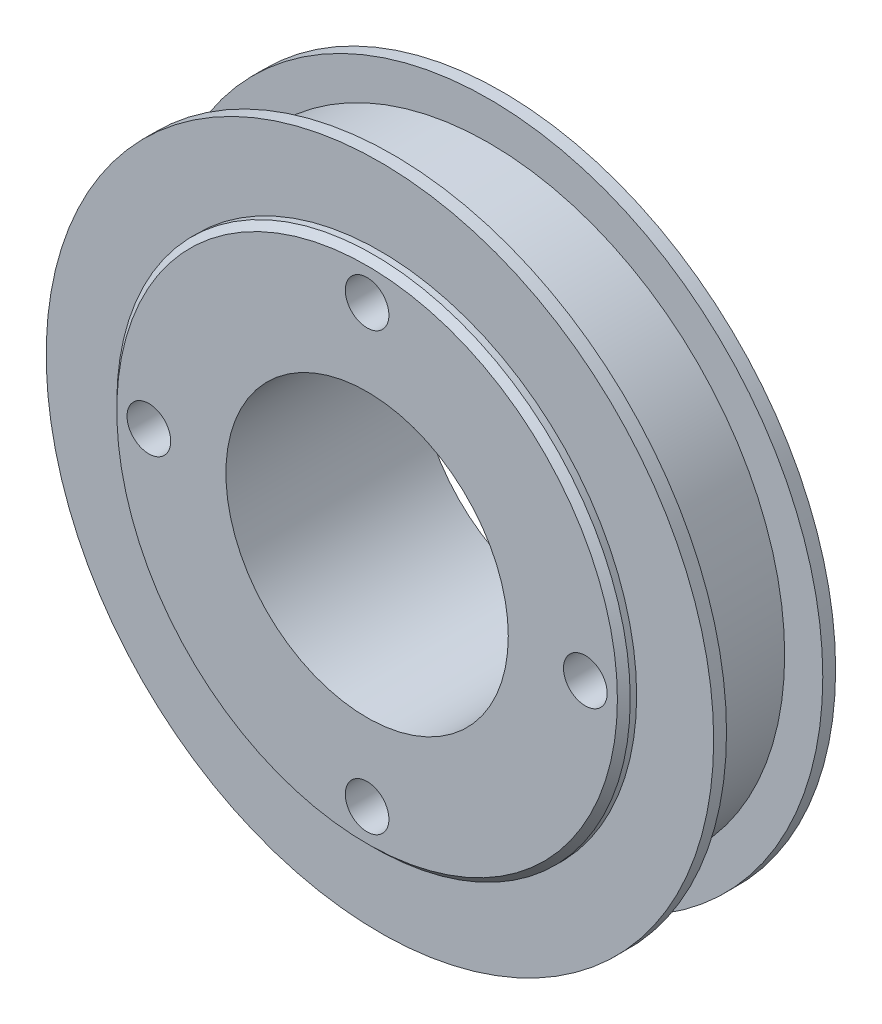
ISO-10303-21;
HEADER;
FILE_DESCRIPTION(('STEP AP214'),'2;1');
FILE_NAME('part.step','',(''),(''),'','','');
FILE_SCHEMA(('AUTOMOTIVE_DESIGN { 1 0 10303 214 1 1 1 1 }'));
ENDSEC;
DATA;
#1=APPLICATION_CONTEXT('core data for automotive mechanical design processes');
#2=APPLICATION_PROTOCOL_DEFINITION('international standard','automotive_design',2000,#1);
#3=PRODUCT_CONTEXT('',#1,'mechanical');
#4=PRODUCT('Part','Part','',(#3));
#5=PRODUCT_RELATED_PRODUCT_CATEGORY('part','',(#4));
#6=PRODUCT_DEFINITION_FORMATION('','',#4);
#7=PRODUCT_DEFINITION_CONTEXT('part definition',#1,'design');
#8=PRODUCT_DEFINITION('design','',#6,#7);
#9=PRODUCT_DEFINITION_SHAPE('','',#8);
#10=(LENGTH_UNIT() NAMED_UNIT(*) SI_UNIT(.MILLI.,.METRE.));
#11=(NAMED_UNIT(*) PLANE_ANGLE_UNIT() SI_UNIT($,.RADIAN.));
#12=(NAMED_UNIT(*) SI_UNIT($,.STERADIAN.) SOLID_ANGLE_UNIT());
#13=UNCERTAINTY_MEASURE_WITH_UNIT(LENGTH_MEASURE(1.E-05),#10,'distance_accuracy_value','');
#14=(GEOMETRIC_REPRESENTATION_CONTEXT(3) GLOBAL_UNCERTAINTY_ASSIGNED_CONTEXT((#13)) GLOBAL_UNIT_ASSIGNED_CONTEXT((#10,
#11,#12)) REPRESENTATION_CONTEXT('',''));
#15=CARTESIAN_POINT('',(0.,0.,0.));
#16=DIRECTION('',(0.,0.,1.));
#17=DIRECTION('',(1.,0.,0.));
#18=AXIS2_PLACEMENT_3D('',#15,#16,#17);
#19=CARTESIAN_POINT('',(0.,0.,15.));
#20=DIRECTION('',(0.,0.,1.));
#21=DIRECTION('',(1.,0.,0.));
#22=AXIS2_PLACEMENT_3D('',#19,#20,#21);
#23=PLANE('',#22);
#24=CARTESIAN_POINT('',(0.,0.,15.));
#25=DIRECTION('',(0.,0.,1.));
#26=DIRECTION('',(1.,0.,0.));
#27=AXIS2_PLACEMENT_3D('',#24,#25,#26);
#28=CIRCLE('',#27,19.5);
#29=CARTESIAN_POINT('',(19.5,0.,15.));
#30=VERTEX_POINT('',#29);
#31=EDGE_CURVE('E65',#30,#30,#28,.T.);
#32=ORIENTED_EDGE('',*,*,#31,.T.);
#33=EDGE_LOOP('',(#32));
#34=FACE_BOUND('',#33,.T.);
#35=CARTESIAN_POINT('',(0.,17.,15.));
#36=DIRECTION('',(0.,0.,-1.));
#37=DIRECTION('',(-1.,0.,0.));
#38=AXIS2_PLACEMENT_3D('',#35,#36,#37);
#39=CIRCLE('',#38,1.69999999999999);
#40=CARTESIAN_POINT('',(-1.69999999999999,17.,15.));
#41=VERTEX_POINT('',#40);
#42=EDGE_CURVE('E151',#41,#41,#39,.T.);
#43=ORIENTED_EDGE('',*,*,#42,.T.);
#44=EDGE_LOOP('',(#43));
#45=FACE_BOUND('',#44,.T.);
#46=CARTESIAN_POINT('',(-17.,0.,15.));
#47=DIRECTION('',(0.,0.,-1.));
#48=DIRECTION('',(-1.,0.,0.));
#49=AXIS2_PLACEMENT_3D('',#46,#47,#48);
#50=CIRCLE('',#49,1.69999999999999);
#51=CARTESIAN_POINT('',(-18.7,0.,15.));
#52=VERTEX_POINT('',#51);
#53=EDGE_CURVE('E143',#52,#52,#50,.T.);
#54=ORIENTED_EDGE('',*,*,#53,.T.);
#55=EDGE_LOOP('',(#54));
#56=FACE_BOUND('',#55,.T.);
#57=CARTESIAN_POINT('',(0.,-17.,15.));
#58=DIRECTION('',(0.,0.,-1.));
#59=DIRECTION('',(-1.,0.,0.));
#60=AXIS2_PLACEMENT_3D('',#57,#58,#59);
#61=CIRCLE('',#60,1.69999999999999);
#62=CARTESIAN_POINT('',(-1.69999999999999,-17.,15.));
#63=VERTEX_POINT('',#62);
#64=EDGE_CURVE('E135',#63,#63,#61,.T.);
#65=ORIENTED_EDGE('',*,*,#64,.T.);
#66=EDGE_LOOP('',(#65));
#67=FACE_BOUND('',#66,.T.);
#68=CARTESIAN_POINT('',(0.,0.,15.));
#69=DIRECTION('',(0.,0.,1.));
#70=DIRECTION('',(1.,0.,0.));
#71=AXIS2_PLACEMENT_3D('',#68,#69,#70);
#72=CIRCLE('',#71,11.);
#73=CARTESIAN_POINT('',(11.,0.,15.));
#74=VERTEX_POINT('',#73);
#75=EDGE_CURVE('E120',#74,#74,#72,.T.);
#76=ORIENTED_EDGE('',*,*,#75,.F.);
#77=EDGE_LOOP('',(#76));
#78=FACE_BOUND('',#77,.T.);
#79=CARTESIAN_POINT('',(17.,0.,15.));
#80=DIRECTION('',(0.,0.,-1.));
#81=DIRECTION('',(-1.,0.,0.));
#82=AXIS2_PLACEMENT_3D('',#79,#80,#81);
#83=CIRCLE('',#82,1.69999999999999);
#84=CARTESIAN_POINT('',(15.3,0.,15.));
#85=VERTEX_POINT('',#84);
#86=EDGE_CURVE('E124',#85,#85,#83,.T.);
#87=ORIENTED_EDGE('',*,*,#86,.T.);
#88=EDGE_LOOP('',(#87));
#89=FACE_BOUND('',#88,.T.);
#90=ADVANCED_FACE('F56',(#34,#45,#56,#67,#78,#89),#23,.T.);
#91=CARTESIAN_POINT('',(0.,0.,3.5));
#92=DIRECTION('',(0.,0.,-1.));
#93=DIRECTION('',(-1.,0.,0.));
#94=AXIS2_PLACEMENT_3D('',#91,#92,#93);
#95=CYLINDRICAL_SURFACE('',#94,13.);
#96=CARTESIAN_POINT('',(0.,0.,3.5));
#97=DIRECTION('',(0.,0.,1.));
#98=DIRECTION('',(1.,0.,0.));
#99=AXIS2_PLACEMENT_3D('',#96,#97,#98);
#100=CIRCLE('',#99,13.);
#101=CARTESIAN_POINT('',(13.,0.,3.5));
#102=VERTEX_POINT('',#101);
#103=EDGE_CURVE('E84',#102,#102,#100,.T.);
#104=ORIENTED_EDGE('',*,*,#103,.F.);
#105=EDGE_LOOP('',(#104));
#106=FACE_BOUND('',#105,.T.);
#107=CARTESIAN_POINT('',(0.,0.,0.));
#108=DIRECTION('',(0.,0.,1.));
#109=DIRECTION('',(1.,0.,0.));
#110=AXIS2_PLACEMENT_3D('',#107,#108,#109);
#111=CIRCLE('',#110,13.);
#112=CARTESIAN_POINT('',(13.,0.,0.));
#113=VERTEX_POINT('',#112);
#114=EDGE_CURVE('E80',#113,#113,#111,.T.);
#115=ORIENTED_EDGE('',*,*,#114,.T.);
#116=EDGE_LOOP('',(#115));
#117=FACE_BOUND('',#116,.T.);
#118=ADVANCED_FACE('F186',(#106,#117),#95,.T.);
#119=CARTESIAN_POINT('',(0.,0.,0.));
#120=DIRECTION('',(0.,0.,1.));
#121=DIRECTION('',(1.,0.,0.));
#122=AXIS2_PLACEMENT_3D('',#119,#120,#121);
#123=PLANE('',#122);
#124=CARTESIAN_POINT('',(0.,0.,0.));
#125=DIRECTION('',(0.,0.,1.));
#126=DIRECTION('',(1.,0.,0.));
#127=AXIS2_PLACEMENT_3D('',#124,#125,#126);
#128=CIRCLE('',#127,11.);
#129=CARTESIAN_POINT('',(11.,0.,0.));
#130=VERTEX_POINT('',#129);
#131=EDGE_CURVE('E116',#130,#130,#128,.T.);
#132=ORIENTED_EDGE('',*,*,#131,.T.);
#133=EDGE_LOOP('',(#132));
#134=FACE_BOUND('',#133,.T.);
#135=ORIENTED_EDGE('',*,*,#114,.F.);
#136=EDGE_LOOP('',(#135));
#137=FACE_BOUND('',#136,.T.);
#138=ADVANCED_FACE('F180',(#134,#137),#123,.F.);
#139=CARTESIAN_POINT('',(0.,0.,4.5));
#140=DIRECTION('',(0.,0.,-1.));
#141=DIRECTION('',(-1.,0.,0.));
#142=AXIS2_PLACEMENT_3D('',#139,#140,#141);
#143=CYLINDRICAL_SURFACE('',#142,20.);
#144=CARTESIAN_POINT('',(0.,0.,4.5));
#145=DIRECTION('',(0.,0.,1.));
#146=DIRECTION('',(1.,0.,0.));
#147=AXIS2_PLACEMENT_3D('',#144,#145,#146);
#148=CIRCLE('',#147,20.);
#149=CARTESIAN_POINT('',(20.,0.,4.5));
#150=VERTEX_POINT('',#149);
#151=EDGE_CURVE('E85',#150,#150,#148,.T.);
#152=ORIENTED_EDGE('',*,*,#151,.F.);
#153=EDGE_LOOP('',(#152));
#154=FACE_BOUND('',#153,.T.);
#155=CARTESIAN_POINT('',(0.,0.,3.5));
#156=DIRECTION('',(0.,0.,1.));
#157=DIRECTION('',(1.,0.,0.));
#158=AXIS2_PLACEMENT_3D('',#155,#156,#157);
#159=CIRCLE('',#158,20.);
#160=CARTESIAN_POINT('',(20.,0.,3.5));
#161=VERTEX_POINT('',#160);
#162=EDGE_CURVE('E89',#161,#161,#159,.T.);
#163=ORIENTED_EDGE('',*,*,#162,.T.);
#164=EDGE_LOOP('',(#163));
#165=FACE_BOUND('',#164,.T.);
#166=ADVANCED_FACE('F167',(#154,#165),#143,.T.);
#167=CARTESIAN_POINT('',(0.,0.,3.5));
#168=DIRECTION('',(0.,0.,1.));
#169=DIRECTION('',(1.,0.,0.));
#170=AXIS2_PLACEMENT_3D('',#167,#168,#169);
#171=PLANE('',#170);
#172=CARTESIAN_POINT('',(0.,17.,3.5));
#173=DIRECTION('',(0.,0.,-1.));
#174=DIRECTION('',(-1.,0.,0.));
#175=AXIS2_PLACEMENT_3D('',#172,#173,#174);
#176=CIRCLE('',#175,1.69999999999999);
#177=CARTESIAN_POINT('',(-1.69999999999999,17.,3.5));
#178=VERTEX_POINT('',#177);
#179=EDGE_CURVE('E155',#178,#178,#176,.T.);
#180=ORIENTED_EDGE('',*,*,#179,.F.);
#181=EDGE_LOOP('',(#180));
#182=FACE_BOUND('',#181,.T.);
#183=CARTESIAN_POINT('',(-17.,0.,3.5));
#184=DIRECTION('',(0.,0.,-1.));
#185=DIRECTION('',(-1.,0.,0.));
#186=AXIS2_PLACEMENT_3D('',#183,#184,#185);
#187=CIRCLE('',#186,1.69999999999999);
#188=CARTESIAN_POINT('',(-18.7,0.,3.5));
#189=VERTEX_POINT('',#188);
#190=EDGE_CURVE('E147',#189,#189,#187,.T.);
#191=ORIENTED_EDGE('',*,*,#190,.F.);
#192=EDGE_LOOP('',(#191));
#193=FACE_BOUND('',#192,.T.);
#194=CARTESIAN_POINT('',(0.,-17.,3.5));
#195=DIRECTION('',(0.,0.,-1.));
#196=DIRECTION('',(-1.,0.,0.));
#197=AXIS2_PLACEMENT_3D('',#194,#195,#196);
#198=CIRCLE('',#197,1.69999999999999);
#199=CARTESIAN_POINT('',(-1.69999999999999,-17.,3.5));
#200=VERTEX_POINT('',#199);
#201=EDGE_CURVE('E139',#200,#200,#198,.T.);
#202=ORIENTED_EDGE('',*,*,#201,.F.);
#203=EDGE_LOOP('',(#202));
#204=FACE_BOUND('',#203,.T.);
#205=CARTESIAN_POINT('',(17.,0.,3.5));
#206=DIRECTION('',(0.,0.,-1.));
#207=DIRECTION('',(-1.,0.,0.));
#208=AXIS2_PLACEMENT_3D('',#205,#206,#207);
#209=CIRCLE('',#208,1.69999999999999);
#210=CARTESIAN_POINT('',(15.3,0.,3.5));
#211=VERTEX_POINT('',#210);
#212=EDGE_CURVE('E131',#211,#211,#209,.T.);
#213=ORIENTED_EDGE('',*,*,#212,.F.);
#214=EDGE_LOOP('',(#213));
#215=FACE_BOUND('',#214,.T.);
#216=ORIENTED_EDGE('',*,*,#103,.T.);
#217=EDGE_LOOP('',(#216));
#218=FACE_BOUND('',#217,.T.);
#219=ORIENTED_EDGE('',*,*,#162,.F.);
#220=EDGE_LOOP('',(#219));
#221=FACE_BOUND('',#220,.T.);
#222=ADVANCED_FACE('F163',(#182,#193,#204,#215,#218,#221),#171,.F.);
#223=CARTESIAN_POINT('',(0.,0.,5.5));
#224=DIRECTION('',(0.,0.,-1.));
#225=DIRECTION('',(-1.,0.,0.));
#226=AXIS2_PLACEMENT_3D('',#223,#224,#225);
#227=CYLINDRICAL_SURFACE('',#226,26.);
#228=CARTESIAN_POINT('',(0.,0.,5.5));
#229=DIRECTION('',(0.,0.,1.));
#230=DIRECTION('',(1.,0.,0.));
#231=AXIS2_PLACEMENT_3D('',#228,#229,#230);
#232=CIRCLE('',#231,26.);
#233=CARTESIAN_POINT('',(26.,0.,5.5));
#234=VERTEX_POINT('',#233);
#235=EDGE_CURVE('E93',#234,#234,#232,.T.);
#236=ORIENTED_EDGE('',*,*,#235,.F.);
#237=EDGE_LOOP('',(#236));
#238=FACE_BOUND('',#237,.T.);
#239=CARTESIAN_POINT('',(0.,0.,4.5));
#240=DIRECTION('',(0.,0.,1.));
#241=DIRECTION('',(1.,0.,0.));
#242=AXIS2_PLACEMENT_3D('',#239,#240,#241);
#243=CIRCLE('',#242,26.);
#244=CARTESIAN_POINT('',(26.,0.,4.5));
#245=VERTEX_POINT('',#244);
#246=EDGE_CURVE('E97',#245,#245,#243,.T.);
#247=ORIENTED_EDGE('',*,*,#246,.T.);
#248=EDGE_LOOP('',(#247));
#249=FACE_BOUND('',#248,.T.);
#250=ADVANCED_FACE('F166',(#238,#249),#227,.T.);
#251=CARTESIAN_POINT('',(0.,0.,5.5));
#252=DIRECTION('',(0.,0.,1.));
#253=DIRECTION('',(1.,0.,0.));
#254=AXIS2_PLACEMENT_3D('',#251,#252,#253);
#255=PLANE('',#254);
#256=CARTESIAN_POINT('',(0.,0.,5.5));
#257=DIRECTION('',(0.,0.,1.));
#258=DIRECTION('',(1.,0.,0.));
#259=AXIS2_PLACEMENT_3D('',#256,#257,#258);
#260=CIRCLE('',#259,23.03);
#261=CARTESIAN_POINT('',(23.03,0.,5.5));
#262=VERTEX_POINT('',#261);
#263=EDGE_CURVE('E77',#262,#262,#260,.T.);
#264=ORIENTED_EDGE('',*,*,#263,.F.);
#265=EDGE_LOOP('',(#264));
#266=FACE_BOUND('',#265,.T.);
#267=ORIENTED_EDGE('',*,*,#235,.T.);
#268=EDGE_LOOP('',(#267));
#269=FACE_BOUND('',#268,.T.);
#270=ADVANCED_FACE('F221',(#266,#269),#255,.T.);
#271=CARTESIAN_POINT('',(0.,0.,4.5));
#272=DIRECTION('',(0.,0.,1.));
#273=DIRECTION('',(1.,0.,0.));
#274=AXIS2_PLACEMENT_3D('',#271,#272,#273);
#275=PLANE('',#274);
#276=ORIENTED_EDGE('',*,*,#151,.T.);
#277=EDGE_LOOP('',(#276));
#278=FACE_BOUND('',#277,.T.);
#279=ORIENTED_EDGE('',*,*,#246,.F.);
#280=EDGE_LOOP('',(#279));
#281=FACE_BOUND('',#280,.T.);
#282=ADVANCED_FACE('F219',(#278,#281),#275,.F.);
#283=CARTESIAN_POINT('',(0.,0.,13.));
#284=DIRECTION('',(0.,0.,-1.));
#285=DIRECTION('',(-1.,0.,0.));
#286=AXIS2_PLACEMENT_3D('',#283,#284,#285);
#287=CYLINDRICAL_SURFACE('',#286,23.03);
#288=CARTESIAN_POINT('',(0.,0.,13.));
#289=DIRECTION('',(0.,0.,1.));
#290=DIRECTION('',(1.,0.,0.));
#291=AXIS2_PLACEMENT_3D('',#288,#289,#290);
#292=CIRCLE('',#291,23.03);
#293=CARTESIAN_POINT('',(23.03,0.,13.));
#294=VERTEX_POINT('',#293);
#295=EDGE_CURVE('E101',#294,#294,#292,.T.);
#296=ORIENTED_EDGE('',*,*,#295,.F.);
#297=EDGE_LOOP('',(#296));
#298=FACE_BOUND('',#297,.T.);
#299=ORIENTED_EDGE('',*,*,#263,.T.);
#300=EDGE_LOOP('',(#299));
#301=FACE_BOUND('',#300,.T.);
#302=ADVANCED_FACE('F215',(#298,#301),#287,.T.);
#303=CARTESIAN_POINT('',(0.,0.,14.));
#304=DIRECTION('',(0.,0.,-1.));
#305=DIRECTION('',(-1.,0.,0.));
#306=AXIS2_PLACEMENT_3D('',#303,#304,#305);
#307=CYLINDRICAL_SURFACE('',#306,26.);
#308=CARTESIAN_POINT('',(0.,0.,14.));
#309=DIRECTION('',(0.,0.,1.));
#310=DIRECTION('',(1.,0.,0.));
#311=AXIS2_PLACEMENT_3D('',#308,#309,#310);
#312=CIRCLE('',#311,26.);
#313=CARTESIAN_POINT('',(26.,0.,14.));
#314=VERTEX_POINT('',#313);
#315=EDGE_CURVE('E111',#314,#314,#312,.T.);
#316=ORIENTED_EDGE('',*,*,#315,.F.);
#317=EDGE_LOOP('',(#316));
#318=FACE_BOUND('',#317,.T.);
#319=CARTESIAN_POINT('',(0.,0.,13.));
#320=DIRECTION('',(0.,0.,1.));
#321=DIRECTION('',(1.,0.,0.));
#322=AXIS2_PLACEMENT_3D('',#319,#320,#321);
#323=CIRCLE('',#322,26.);
#324=CARTESIAN_POINT('',(26.,0.,13.));
#325=VERTEX_POINT('',#324);
#326=EDGE_CURVE('E112',#325,#325,#323,.T.);
#327=ORIENTED_EDGE('',*,*,#326,.T.);
#328=EDGE_LOOP('',(#327));
#329=FACE_BOUND('',#328,.T.);
#330=ADVANCED_FACE('F208',(#318,#329),#307,.T.);
#331=CARTESIAN_POINT('',(0.,0.,14.));
#332=DIRECTION('',(0.,0.,1.));
#333=DIRECTION('',(1.,0.,0.));
#334=AXIS2_PLACEMENT_3D('',#331,#332,#333);
#335=PLANE('',#334);
#336=CARTESIAN_POINT('',(0.,0.,14.));
#337=DIRECTION('',(0.,0.,1.));
#338=DIRECTION('',(1.,0.,0.));
#339=AXIS2_PLACEMENT_3D('',#336,#337,#338);
#340=CIRCLE('',#339,20.);
#341=CARTESIAN_POINT('',(20.,0.,14.));
#342=VERTEX_POINT('',#341);
#343=EDGE_CURVE('E71',#342,#342,#340,.T.);
#344=ORIENTED_EDGE('',*,*,#343,.F.);
#345=EDGE_LOOP('',(#344));
#346=FACE_BOUND('',#345,.T.);
#347=ORIENTED_EDGE('',*,*,#315,.T.);
#348=EDGE_LOOP('',(#347));
#349=FACE_BOUND('',#348,.T.);
#350=ADVANCED_FACE('F205',(#346,#349),#335,.T.);
#351=CARTESIAN_POINT('',(0.,0.,13.));
#352=DIRECTION('',(0.,0.,1.));
#353=DIRECTION('',(1.,0.,0.));
#354=AXIS2_PLACEMENT_3D('',#351,#352,#353);
#355=PLANE('',#354);
#356=ORIENTED_EDGE('',*,*,#295,.T.);
#357=EDGE_LOOP('',(#356));
#358=FACE_BOUND('',#357,.T.);
#359=ORIENTED_EDGE('',*,*,#326,.F.);
#360=EDGE_LOOP('',(#359));
#361=FACE_BOUND('',#360,.T.);
#362=ADVANCED_FACE('F204',(#358,#361),#355,.F.);
#363=CARTESIAN_POINT('',(0.,0.,15.));
#364=DIRECTION('',(0.,0.,-1.));
#365=DIRECTION('',(-1.,0.,0.));
#366=AXIS2_PLACEMENT_3D('',#363,#364,#365);
#367=CYLINDRICAL_SURFACE('',#366,20.);
#368=CARTESIAN_POINT('',(0.,0.,14.5));
#369=DIRECTION('',(0.,0.,1.));
#370=DIRECTION('',(1.,0.,0.));
#371=AXIS2_PLACEMENT_3D('',#368,#369,#370);
#372=CIRCLE('',#371,20.);
#373=CARTESIAN_POINT('',(20.,0.,14.5));
#374=VERTEX_POINT('',#373);
#375=EDGE_CURVE('E12',#374,#374,#372,.F.);
#376=ORIENTED_EDGE('',*,*,#375,.T.);
#377=EDGE_LOOP('',(#376));
#378=FACE_BOUND('',#377,.T.);
#379=ORIENTED_EDGE('',*,*,#343,.T.);
#380=EDGE_LOOP('',(#379));
#381=FACE_BOUND('',#380,.T.);
#382=ADVANCED_FACE('F201',(#378,#381),#367,.T.);
#383=CARTESIAN_POINT('',(0.,0.,0.));
#384=DIRECTION('',(0.,0.,1.));
#385=DIRECTION('',(1.,0.,0.));
#386=AXIS2_PLACEMENT_3D('',#383,#384,#385);
#387=CYLINDRICAL_SURFACE('',#386,11.);
#388=ORIENTED_EDGE('',*,*,#131,.F.);
#389=EDGE_LOOP('',(#388));
#390=FACE_BOUND('',#389,.T.);
#391=ORIENTED_EDGE('',*,*,#75,.T.);
#392=EDGE_LOOP('',(#391));
#393=FACE_BOUND('',#392,.T.);
#394=ADVANCED_FACE('F199',(#390,#393),#387,.F.);
#395=CARTESIAN_POINT('',(17.,0.,3.5));
#396=DIRECTION('',(0.,0.,-1.));
#397=DIRECTION('',(-1.,0.,0.));
#398=AXIS2_PLACEMENT_3D('',#395,#396,#397);
#399=CYLINDRICAL_SURFACE('',#398,1.69999999999999);
#400=ORIENTED_EDGE('',*,*,#86,.F.);
#401=EDGE_LOOP('',(#400));
#402=FACE_BOUND('',#401,.T.);
#403=ORIENTED_EDGE('',*,*,#212,.T.);
#404=EDGE_LOOP('',(#403));
#405=FACE_BOUND('',#404,.T.);
#406=ADVANCED_FACE('F275',(#402,#405),#399,.F.);
#407=CARTESIAN_POINT('',(0.,-17.,3.5));
#408=DIRECTION('',(0.,0.,-1.));
#409=DIRECTION('',(-1.,0.,0.));
#410=AXIS2_PLACEMENT_3D('',#407,#408,#409);
#411=CYLINDRICAL_SURFACE('',#410,1.69999999999999);
#412=ORIENTED_EDGE('',*,*,#64,.F.);
#413=EDGE_LOOP('',(#412));
#414=FACE_BOUND('',#413,.T.);
#415=ORIENTED_EDGE('',*,*,#201,.T.);
#416=EDGE_LOOP('',(#415));
#417=FACE_BOUND('',#416,.T.);
#418=ADVANCED_FACE('F282',(#414,#417),#411,.F.);
#419=CARTESIAN_POINT('',(-17.,0.,3.5));
#420=DIRECTION('',(0.,0.,-1.));
#421=DIRECTION('',(-1.,0.,0.));
#422=AXIS2_PLACEMENT_3D('',#419,#420,#421);
#423=CYLINDRICAL_SURFACE('',#422,1.69999999999999);
#424=ORIENTED_EDGE('',*,*,#53,.F.);
#425=EDGE_LOOP('',(#424));
#426=FACE_BOUND('',#425,.T.);
#427=ORIENTED_EDGE('',*,*,#190,.T.);
#428=EDGE_LOOP('',(#427));
#429=FACE_BOUND('',#428,.T.);
#430=ADVANCED_FACE('F289',(#426,#429),#423,.F.);
#431=CARTESIAN_POINT('',(0.,17.,3.5));
#432=DIRECTION('',(0.,0.,-1.));
#433=DIRECTION('',(-1.,0.,0.));
#434=AXIS2_PLACEMENT_3D('',#431,#432,#433);
#435=CYLINDRICAL_SURFACE('',#434,1.69999999999999);
#436=ORIENTED_EDGE('',*,*,#42,.F.);
#437=EDGE_LOOP('',(#436));
#438=FACE_BOUND('',#437,.T.);
#439=ORIENTED_EDGE('',*,*,#179,.T.);
#440=EDGE_LOOP('',(#439));
#441=FACE_BOUND('',#440,.T.);
#442=ADVANCED_FACE('F161',(#438,#441),#435,.F.);
#443=CARTESIAN_POINT('',(0.,0.,15.));
#444=DIRECTION('',(0.,0.,-1.));
#445=DIRECTION('',(-1.,0.,0.));
#446=AXIS2_PLACEMENT_3D('',#443,#444,#445);
#447=CONICAL_SURFACE('',#446,19.5,0.785398163397438);
#448=ORIENTED_EDGE('',*,*,#375,.F.);
#449=EDGE_LOOP('',(#448));
#450=FACE_BOUND('',#449,.T.);
#451=ORIENTED_EDGE('',*,*,#31,.F.);
#452=EDGE_LOOP('',(#451));
#453=FACE_BOUND('',#452,.T.);
#454=ADVANCED_FACE('F59',(#450,#453),#447,.T.);
#455=CLOSED_SHELL('',(#90,#118,#138,#166,#222,#250,#270,#282,#302,#330,#350,#362,#382,#394,#406,
#418,#430,#442,#454));
#456=MANIFOLD_SOLID_BREP('B2',#455);
#457=ADVANCED_BREP_SHAPE_REPRESENTATION('',(#18,#456),#14);
#458=SHAPE_DEFINITION_REPRESENTATION(#9,#457);
ENDSEC;
END-ISO-10303-21;
